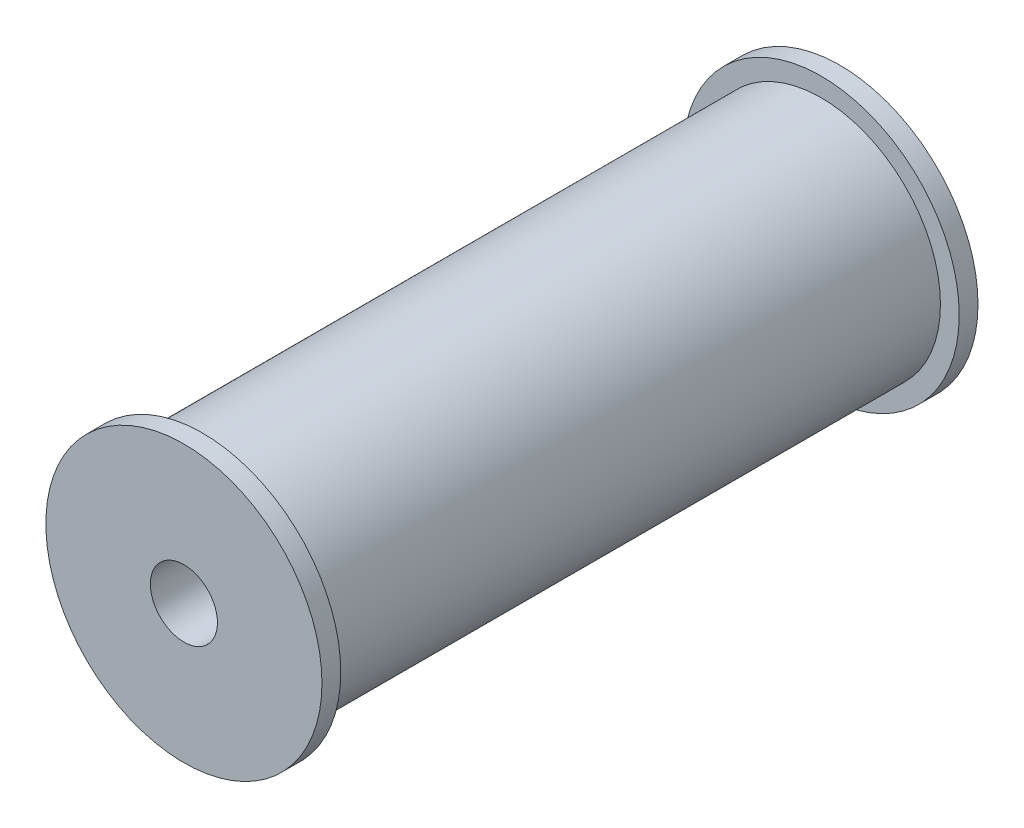
ISO-10303-21;
HEADER;
FILE_DESCRIPTION(('STEP AP214'),'2;1');
FILE_NAME('part.step','',(''),(''),'','','');
FILE_SCHEMA(('AUTOMOTIVE_DESIGN { 1 0 10303 214 1 1 1 1 }'));
ENDSEC;
DATA;
#1=APPLICATION_CONTEXT('core data for automotive mechanical design processes');
#2=APPLICATION_PROTOCOL_DEFINITION('international standard','automotive_design',2000,#1);
#3=PRODUCT_CONTEXT('',#1,'mechanical');
#4=PRODUCT('Part','Part','',(#3));
#5=PRODUCT_RELATED_PRODUCT_CATEGORY('part','',(#4));
#6=PRODUCT_DEFINITION_FORMATION('','',#4);
#7=PRODUCT_DEFINITION_CONTEXT('part definition',#1,'design');
#8=PRODUCT_DEFINITION('design','',#6,#7);
#9=PRODUCT_DEFINITION_SHAPE('','',#8);
#10=(LENGTH_UNIT() NAMED_UNIT(*) SI_UNIT(.MILLI.,.METRE.));
#11=(NAMED_UNIT(*) PLANE_ANGLE_UNIT() SI_UNIT($,.RADIAN.));
#12=(NAMED_UNIT(*) SI_UNIT($,.STERADIAN.) SOLID_ANGLE_UNIT());
#13=UNCERTAINTY_MEASURE_WITH_UNIT(LENGTH_MEASURE(1.E-05),#10,'distance_accuracy_value','');
#14=(GEOMETRIC_REPRESENTATION_CONTEXT(3) GLOBAL_UNCERTAINTY_ASSIGNED_CONTEXT((#13)) GLOBAL_UNIT_ASSIGNED_CONTEXT((#10,
#11,#12)) REPRESENTATION_CONTEXT('',''));
#15=CARTESIAN_POINT('',(0.,0.,0.));
#16=DIRECTION('',(0.,0.,1.));
#17=DIRECTION('',(1.,0.,0.));
#18=AXIS2_PLACEMENT_3D('',#15,#16,#17);
#19=CARTESIAN_POINT('',(0.,0.,69.85));
#20=DIRECTION('',(0.,0.,-1.));
#21=DIRECTION('',(-1.,0.,0.));
#22=AXIS2_PLACEMENT_3D('',#19,#20,#21);
#23=CYLINDRICAL_SURFACE('',#22,12.7);
#24=CARTESIAN_POINT('',(0.,0.,2.));
#25=DIRECTION('',(0.,0.,1.));
#26=DIRECTION('',(1.,0.,0.));
#27=AXIS2_PLACEMENT_3D('',#24,#25,#26);
#28=CIRCLE('',#27,12.7);
#29=CARTESIAN_POINT('',(12.7,0.,2.));
#30=VERTEX_POINT('',#29);
#31=EDGE_CURVE('E50',#30,#30,#28,.T.);
#32=ORIENTED_EDGE('',*,*,#31,.T.);
#33=EDGE_LOOP('',(#32));
#34=FACE_BOUND('',#33,.T.);
#35=CARTESIAN_POINT('',(0.,0.,67.85));
#36=DIRECTION('',(0.,0.,1.));
#37=DIRECTION('',(1.,0.,0.));
#38=AXIS2_PLACEMENT_3D('',#35,#36,#37);
#39=CIRCLE('',#38,12.7);
#40=CARTESIAN_POINT('',(12.7,0.,67.85));
#41=VERTEX_POINT('',#40);
#42=EDGE_CURVE('E10',#41,#41,#39,.T.);
#43=ORIENTED_EDGE('',*,*,#42,.F.);
#44=EDGE_LOOP('',(#43));
#45=FACE_BOUND('',#44,.T.);
#46=ADVANCED_FACE('F31',(#34,#45),#23,.T.);
#47=CARTESIAN_POINT('',(0.,0.,69.85));
#48=DIRECTION('',(0.,0.,1.));
#49=DIRECTION('',(1.,0.,0.));
#50=AXIS2_PLACEMENT_3D('',#47,#48,#49);
#51=PLANE('',#50);
#52=CARTESIAN_POINT('',(0.,0.,69.85));
#53=DIRECTION('',(0.,0.,1.));
#54=DIRECTION('',(1.,0.,0.));
#55=AXIS2_PLACEMENT_3D('',#52,#53,#54);
#56=CIRCLE('',#55,3.572);
#57=CARTESIAN_POINT('',(3.572,0.,69.85));
#58=VERTEX_POINT('',#57);
#59=EDGE_CURVE('E42',#58,#58,#56,.T.);
#60=ORIENTED_EDGE('',*,*,#59,.F.);
#61=EDGE_LOOP('',(#60));
#62=FACE_BOUND('',#61,.T.);
#63=CARTESIAN_POINT('',(0.,0.,69.85));
#64=DIRECTION('',(0.,0.,1.));
#65=DIRECTION('',(1.,0.,0.));
#66=AXIS2_PLACEMENT_3D('',#63,#64,#65);
#67=CIRCLE('',#66,14.7);
#68=CARTESIAN_POINT('',(14.7,0.,69.85));
#69=VERTEX_POINT('',#68);
#70=EDGE_CURVE('E45',#69,#69,#67,.T.);
#71=ORIENTED_EDGE('',*,*,#70,.T.);
#72=EDGE_LOOP('',(#71));
#73=FACE_BOUND('',#72,.T.);
#74=ADVANCED_FACE('F62',(#62,#73),#51,.T.);
#75=CARTESIAN_POINT('',(0.,0.,0.));
#76=DIRECTION('',(0.,0.,1.));
#77=DIRECTION('',(1.,0.,0.));
#78=AXIS2_PLACEMENT_3D('',#75,#76,#77);
#79=PLANE('',#78);
#80=CARTESIAN_POINT('',(0.,0.,0.));
#81=DIRECTION('',(0.,0.,1.));
#82=DIRECTION('',(1.,0.,0.));
#83=AXIS2_PLACEMENT_3D('',#80,#81,#82);
#84=CIRCLE('',#83,3.572);
#85=CARTESIAN_POINT('',(3.572,0.,0.));
#86=VERTEX_POINT('',#85);
#87=EDGE_CURVE('E34',#86,#86,#84,.F.);
#88=ORIENTED_EDGE('',*,*,#87,.F.);
#89=EDGE_LOOP('',(#88));
#90=FACE_BOUND('',#89,.T.);
#91=CARTESIAN_POINT('',(0.,0.,0.));
#92=DIRECTION('',(0.,0.,1.));
#93=DIRECTION('',(1.,0.,0.));
#94=AXIS2_PLACEMENT_3D('',#91,#92,#93);
#95=CIRCLE('',#94,14.7);
#96=CARTESIAN_POINT('',(14.7,0.,0.));
#97=VERTEX_POINT('',#96);
#98=EDGE_CURVE('E51',#97,#97,#95,.T.);
#99=ORIENTED_EDGE('',*,*,#98,.F.);
#100=EDGE_LOOP('',(#99));
#101=FACE_BOUND('',#100,.T.);
#102=ADVANCED_FACE('F65',(#90,#101),#79,.F.);
#103=CARTESIAN_POINT('',(0.,0.,-10.1031416895934));
#104=DIRECTION('',(0.,0.,1.));
#105=DIRECTION('',(1.,0.,0.));
#106=AXIS2_PLACEMENT_3D('',#103,#104,#105);
#107=CYLINDRICAL_SURFACE('',#106,3.572);
#108=ORIENTED_EDGE('',*,*,#59,.T.);
#109=EDGE_LOOP('',(#108));
#110=FACE_BOUND('',#109,.T.);
#111=ORIENTED_EDGE('',*,*,#87,.T.);
#112=EDGE_LOOP('',(#111));
#113=FACE_BOUND('',#112,.T.);
#114=ADVANCED_FACE('F59',(#110,#113),#107,.F.);
#115=CARTESIAN_POINT('',(0.,0.,2.));
#116=DIRECTION('',(0.,0.,1.));
#117=DIRECTION('',(1.,0.,0.));
#118=AXIS2_PLACEMENT_3D('',#115,#116,#117);
#119=PLANE('',#118);
#120=CARTESIAN_POINT('',(0.,0.,2.));
#121=DIRECTION('',(0.,0.,1.));
#122=DIRECTION('',(1.,0.,0.));
#123=AXIS2_PLACEMENT_3D('',#120,#121,#122);
#124=CIRCLE('',#123,14.7);
#125=CARTESIAN_POINT('',(14.7,0.,2.));
#126=VERTEX_POINT('',#125);
#127=EDGE_CURVE('E47',#126,#126,#124,.T.);
#128=ORIENTED_EDGE('',*,*,#127,.T.);
#129=EDGE_LOOP('',(#128));
#130=FACE_BOUND('',#129,.T.);
#131=ORIENTED_EDGE('',*,*,#31,.F.);
#132=EDGE_LOOP('',(#131));
#133=FACE_BOUND('',#132,.T.);
#134=ADVANCED_FACE('F84',(#130,#133),#119,.T.);
#135=CARTESIAN_POINT('',(0.,0.,2.));
#136=DIRECTION('',(0.,0.,-1.));
#137=DIRECTION('',(-1.,0.,0.));
#138=AXIS2_PLACEMENT_3D('',#135,#136,#137);
#139=CYLINDRICAL_SURFACE('',#138,14.7);
#140=ORIENTED_EDGE('',*,*,#127,.F.);
#141=EDGE_LOOP('',(#140));
#142=FACE_BOUND('',#141,.T.);
#143=ORIENTED_EDGE('',*,*,#98,.T.);
#144=EDGE_LOOP('',(#143));
#145=FACE_BOUND('',#144,.T.);
#146=ADVANCED_FACE('F77',(#142,#145),#139,.T.);
#147=CARTESIAN_POINT('',(0.,0.,67.85));
#148=DIRECTION('',(0.,0.,1.));
#149=DIRECTION('',(1.,0.,0.));
#150=AXIS2_PLACEMENT_3D('',#147,#148,#149);
#151=PLANE('',#150);
#152=CARTESIAN_POINT('',(0.,0.,67.85));
#153=DIRECTION('',(0.,0.,1.));
#154=DIRECTION('',(1.,0.,0.));
#155=AXIS2_PLACEMENT_3D('',#152,#153,#154);
#156=CIRCLE('',#155,14.7);
#157=CARTESIAN_POINT('',(14.7,0.,67.85));
#158=VERTEX_POINT('',#157);
#159=EDGE_CURVE('E54',#158,#158,#156,.T.);
#160=ORIENTED_EDGE('',*,*,#159,.F.);
#161=EDGE_LOOP('',(#160));
#162=FACE_BOUND('',#161,.T.);
#163=ORIENTED_EDGE('',*,*,#42,.T.);
#164=EDGE_LOOP('',(#163));
#165=FACE_BOUND('',#164,.T.);
#166=ADVANCED_FACE('F75',(#162,#165),#151,.F.);
#167=CARTESIAN_POINT('',(0.,0.,67.85));
#168=DIRECTION('',(0.,0.,1.));
#169=DIRECTION('',(1.,0.,0.));
#170=AXIS2_PLACEMENT_3D('',#167,#168,#169);
#171=CYLINDRICAL_SURFACE('',#170,14.7);
#172=ORIENTED_EDGE('',*,*,#159,.T.);
#173=EDGE_LOOP('',(#172));
#174=FACE_BOUND('',#173,.T.);
#175=ORIENTED_EDGE('',*,*,#70,.F.);
#176=EDGE_LOOP('',(#175));
#177=FACE_BOUND('',#176,.T.);
#178=ADVANCED_FACE('F73',(#174,#177),#171,.T.);
#179=CLOSED_SHELL('',(#46,#74,#102,#114,#134,#146,#166,#178));
#180=MANIFOLD_SOLID_BREP('B2',#179);
#181=ADVANCED_BREP_SHAPE_REPRESENTATION('',(#18,#180),#14);
#182=SHAPE_DEFINITION_REPRESENTATION(#9,#181);
ENDSEC;
END-ISO-10303-21;
